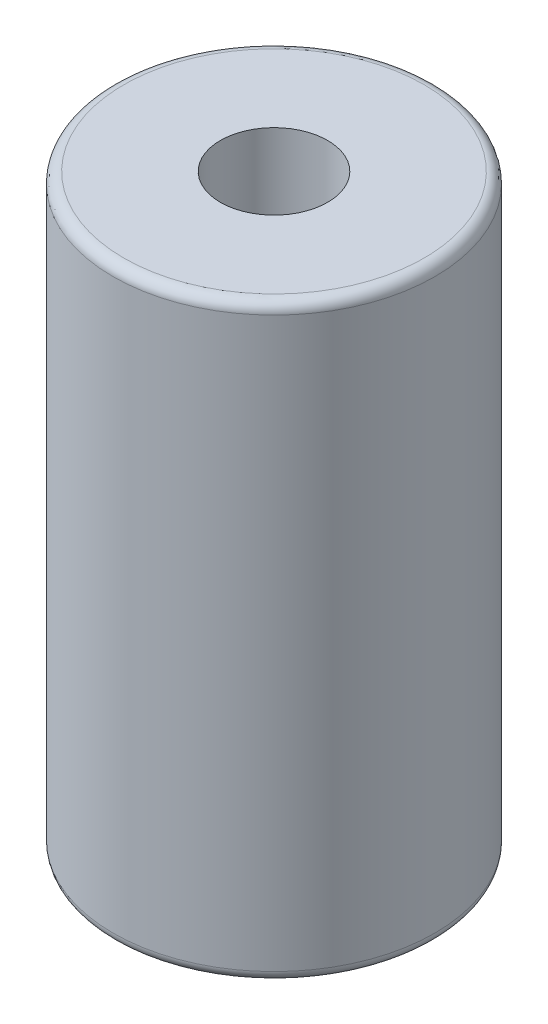
ISO-10303-21;
HEADER;
FILE_DESCRIPTION(('STEP AP214'),'2;1');
FILE_NAME('part.step','',(''),(''),'','','');
FILE_SCHEMA(('AUTOMOTIVE_DESIGN { 1 0 10303 214 1 1 1 1 }'));
ENDSEC;
DATA;
#1=APPLICATION_CONTEXT('core data for automotive mechanical design processes');
#2=APPLICATION_PROTOCOL_DEFINITION('international standard','automotive_design',2000,#1);
#3=PRODUCT_CONTEXT('',#1,'mechanical');
#4=PRODUCT('Part','Part','',(#3));
#5=PRODUCT_RELATED_PRODUCT_CATEGORY('part','',(#4));
#6=PRODUCT_DEFINITION_FORMATION('','',#4);
#7=PRODUCT_DEFINITION_CONTEXT('part definition',#1,'design');
#8=PRODUCT_DEFINITION('design','',#6,#7);
#9=PRODUCT_DEFINITION_SHAPE('','',#8);
#10=(LENGTH_UNIT() NAMED_UNIT(*) SI_UNIT(.MILLI.,.METRE.));
#11=(NAMED_UNIT(*) PLANE_ANGLE_UNIT() SI_UNIT($,.RADIAN.));
#12=(NAMED_UNIT(*) SI_UNIT($,.STERADIAN.) SOLID_ANGLE_UNIT());
#13=UNCERTAINTY_MEASURE_WITH_UNIT(LENGTH_MEASURE(1.E-05),#10,'distance_accuracy_value','');
#14=(GEOMETRIC_REPRESENTATION_CONTEXT(3) GLOBAL_UNCERTAINTY_ASSIGNED_CONTEXT((#13)) GLOBAL_UNIT_ASSIGNED_CONTEXT((#10,
#11,#12)) REPRESENTATION_CONTEXT('',''));
#15=CARTESIAN_POINT('',(0.,0.,0.));
#16=DIRECTION('',(0.,0.,1.));
#17=DIRECTION('',(1.,0.,0.));
#18=AXIS2_PLACEMENT_3D('',#15,#16,#17);
#19=CARTESIAN_POINT('',(0.,5.5,0.));
#20=DIRECTION('',(0.,1.,0.));
#21=DIRECTION('',(0.,0.,1.));
#22=AXIS2_PLACEMENT_3D('',#19,#20,#21);
#23=PLANE('',#22);
#24=CARTESIAN_POINT('',(0.,5.5,0.));
#25=DIRECTION('',(0.,1.,0.));
#26=DIRECTION('',(0.,0.,1.));
#27=AXIS2_PLACEMENT_3D('',#24,#25,#26);
#28=CIRCLE('',#27,1.4);
#29=CARTESIAN_POINT('',(0.,5.5,1.4));
#30=VERTEX_POINT('',#29);
#31=EDGE_CURVE('E10',#30,#30,#28,.T.);
#32=ORIENTED_EDGE('',*,*,#31,.T.);
#33=EDGE_LOOP('',(#32));
#34=FACE_BOUND('',#33,.T.);
#35=CARTESIAN_POINT('',(0.,5.5,0.));
#36=DIRECTION('',(0.,1.,0.));
#37=DIRECTION('',(0.,0.,1.));
#38=AXIS2_PLACEMENT_3D('',#35,#36,#37);
#39=CIRCLE('',#38,0.5);
#40=CARTESIAN_POINT('',(0.,5.5,0.5));
#41=VERTEX_POINT('',#40);
#42=EDGE_CURVE('E61',#41,#41,#39,.T.);
#43=ORIENTED_EDGE('',*,*,#42,.F.);
#44=EDGE_LOOP('',(#43));
#45=FACE_BOUND('',#44,.T.);
#46=ADVANCED_FACE('F37',(#34,#45),#23,.T.);
#47=CARTESIAN_POINT('',(0.,0.,0.));
#48=DIRECTION('',(0.,1.,0.));
#49=DIRECTION('',(0.,0.,1.));
#50=AXIS2_PLACEMENT_3D('',#47,#48,#49);
#51=PLANE('',#50);
#52=CARTESIAN_POINT('',(0.,0.,0.));
#53=DIRECTION('',(0.,1.,0.));
#54=DIRECTION('',(0.,0.,1.));
#55=AXIS2_PLACEMENT_3D('',#52,#53,#54);
#56=CIRCLE('',#55,1.4);
#57=CARTESIAN_POINT('',(0.,0.,1.4));
#58=VERTEX_POINT('',#57);
#59=EDGE_CURVE('E45',#58,#58,#56,.F.);
#60=ORIENTED_EDGE('',*,*,#59,.T.);
#61=EDGE_LOOP('',(#60));
#62=FACE_BOUND('',#61,.T.);
#63=CARTESIAN_POINT('',(0.,0.,0.));
#64=DIRECTION('',(0.,1.,0.));
#65=DIRECTION('',(0.,0.,1.));
#66=AXIS2_PLACEMENT_3D('',#63,#64,#65);
#67=CIRCLE('',#66,0.5);
#68=CARTESIAN_POINT('',(0.,0.,0.5));
#69=VERTEX_POINT('',#68);
#70=EDGE_CURVE('E62',#69,#69,#67,.T.);
#71=ORIENTED_EDGE('',*,*,#70,.T.);
#72=EDGE_LOOP('',(#71));
#73=FACE_BOUND('',#72,.T.);
#74=ADVANCED_FACE('F74',(#62,#73),#51,.F.);
#75=CARTESIAN_POINT('',(0.,5.5,0.));
#76=DIRECTION('',(0.,-1.,0.));
#77=DIRECTION('',(0.,0.,-1.));
#78=AXIS2_PLACEMENT_3D('',#75,#76,#77);
#79=CYLINDRICAL_SURFACE('',#78,1.5);
#80=CARTESIAN_POINT('',(0.,0.1,0.));
#81=DIRECTION('',(0.,1.,0.));
#82=DIRECTION('',(0.,0.,1.));
#83=AXIS2_PLACEMENT_3D('',#80,#81,#82);
#84=CIRCLE('',#83,1.5);
#85=CARTESIAN_POINT('',(0.,0.1,1.5));
#86=VERTEX_POINT('',#85);
#87=EDGE_CURVE('E50',#86,#86,#84,.T.);
#88=ORIENTED_EDGE('',*,*,#87,.T.);
#89=EDGE_LOOP('',(#88));
#90=FACE_BOUND('',#89,.T.);
#91=CARTESIAN_POINT('',(0.,5.4,0.));
#92=DIRECTION('',(0.,1.,0.));
#93=DIRECTION('',(0.,0.,1.));
#94=AXIS2_PLACEMENT_3D('',#91,#92,#93);
#95=CIRCLE('',#94,1.5);
#96=CARTESIAN_POINT('',(0.,5.4,1.5));
#97=VERTEX_POINT('',#96);
#98=EDGE_CURVE('E55',#97,#97,#95,.F.);
#99=ORIENTED_EDGE('',*,*,#98,.T.);
#100=EDGE_LOOP('',(#99));
#101=FACE_BOUND('',#100,.T.);
#102=ADVANCED_FACE('F79',(#90,#101),#79,.T.);
#103=CARTESIAN_POINT('',(0.,5.5,0.));
#104=DIRECTION('',(0.,-1.,0.));
#105=DIRECTION('',(0.,0.,-1.));
#106=AXIS2_PLACEMENT_3D('',#103,#104,#105);
#107=CYLINDRICAL_SURFACE('',#106,0.5);
#108=ORIENTED_EDGE('',*,*,#42,.T.);
#109=EDGE_LOOP('',(#108));
#110=FACE_BOUND('',#109,.T.);
#111=ORIENTED_EDGE('',*,*,#70,.F.);
#112=EDGE_LOOP('',(#111));
#113=FACE_BOUND('',#112,.T.);
#114=ADVANCED_FACE('F70',(#110,#113),#107,.F.);
#115=CARTESIAN_POINT('',(0.,0.1,0.));
#116=DIRECTION('',(0.,1.,0.));
#117=DIRECTION('',(0.,0.,1.));
#118=AXIS2_PLACEMENT_3D('',#115,#116,#117);
#119=TOROIDAL_SURFACE('',#118,1.4,0.1);
#120=ORIENTED_EDGE('',*,*,#59,.F.);
#121=EDGE_LOOP('',(#120));
#122=FACE_BOUND('',#121,.T.);
#123=ORIENTED_EDGE('',*,*,#87,.F.);
#124=EDGE_LOOP('',(#123));
#125=FACE_BOUND('',#124,.T.);
#126=ADVANCED_FACE('F85',(#122,#125),#119,.T.);
#127=CARTESIAN_POINT('',(0.,5.4,0.));
#128=DIRECTION('',(0.,1.,0.));
#129=DIRECTION('',(0.,0.,1.));
#130=AXIS2_PLACEMENT_3D('',#127,#128,#129);
#131=TOROIDAL_SURFACE('',#130,1.4,0.1);
#132=ORIENTED_EDGE('',*,*,#98,.F.);
#133=EDGE_LOOP('',(#132));
#134=FACE_BOUND('',#133,.T.);
#135=ORIENTED_EDGE('',*,*,#31,.F.);
#136=EDGE_LOOP('',(#135));
#137=FACE_BOUND('',#136,.T.);
#138=ADVANCED_FACE('F39',(#134,#137),#131,.T.);
#139=CLOSED_SHELL('',(#46,#74,#102,#114,#126,#138));
#140=MANIFOLD_SOLID_BREP('B2',#139);
#141=ADVANCED_BREP_SHAPE_REPRESENTATION('',(#18,#140),#14);
#142=SHAPE_DEFINITION_REPRESENTATION(#9,#141);
ENDSEC;
END-ISO-10303-21;
